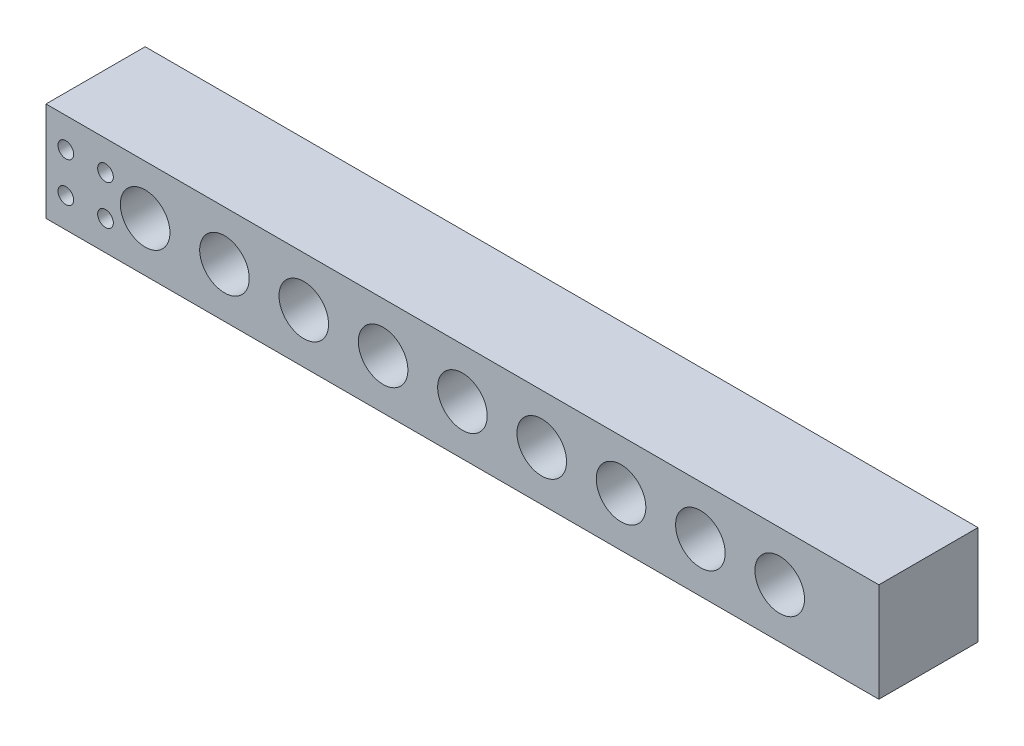
ISO-10303-21;
HEADER;
FILE_DESCRIPTION(('STEP AP214'),'2;1');
FILE_NAME('part.step','',(''),(''),'','','');
FILE_SCHEMA(('AUTOMOTIVE_DESIGN { 1 0 10303 214 1 1 1 1 }'));
ENDSEC;
DATA;
#1=APPLICATION_CONTEXT('core data for automotive mechanical design processes');
#2=APPLICATION_PROTOCOL_DEFINITION('international standard','automotive_design',2000,#1);
#3=PRODUCT_CONTEXT('',#1,'mechanical');
#4=PRODUCT('Part','Part','',(#3));
#5=PRODUCT_RELATED_PRODUCT_CATEGORY('part','',(#4));
#6=PRODUCT_DEFINITION_FORMATION('','',#4);
#7=PRODUCT_DEFINITION_CONTEXT('part definition',#1,'design');
#8=PRODUCT_DEFINITION('design','',#6,#7);
#9=PRODUCT_DEFINITION_SHAPE('','',#8);
#10=(LENGTH_UNIT() NAMED_UNIT(*) SI_UNIT(.MILLI.,.METRE.));
#11=(NAMED_UNIT(*) PLANE_ANGLE_UNIT() SI_UNIT($,.RADIAN.));
#12=(NAMED_UNIT(*) SI_UNIT($,.STERADIAN.) SOLID_ANGLE_UNIT());
#13=UNCERTAINTY_MEASURE_WITH_UNIT(LENGTH_MEASURE(1.E-05),#10,'distance_accuracy_value','');
#14=(GEOMETRIC_REPRESENTATION_CONTEXT(3) GLOBAL_UNCERTAINTY_ASSIGNED_CONTEXT((#13)) GLOBAL_UNIT_ASSIGNED_CONTEXT((#10,
#11,#12)) REPRESENTATION_CONTEXT('',''));
#15=CARTESIAN_POINT('',(0.,0.,0.));
#16=DIRECTION('',(0.,0.,1.));
#17=DIRECTION('',(1.,0.,0.));
#18=AXIS2_PLACEMENT_3D('',#15,#16,#17);
#19=CARTESIAN_POINT('',(-31.75,-15.875,0.));
#20=DIRECTION('',(0.,0.,1.));
#21=DIRECTION('',(1.,0.,0.));
#22=AXIS2_PLACEMENT_3D('',#19,#20,#21);
#23=CYLINDRICAL_SURFACE('',#22,7.93749999999998);
#24=CARTESIAN_POINT('',(-31.75,-15.875,0.));
#25=DIRECTION('',(0.,0.,1.));
#26=DIRECTION('',(1.,0.,0.));
#27=AXIS2_PLACEMENT_3D('',#24,#25,#26);
#28=CIRCLE('',#27,7.93749999999998);
#29=CARTESIAN_POINT('',(-23.8125,-15.875,0.));
#30=VERTEX_POINT('',#29);
#31=EDGE_CURVE('E41',#30,#30,#28,.T.);
#32=ORIENTED_EDGE('',*,*,#31,.F.);
#33=EDGE_LOOP('',(#32));
#34=FACE_BOUND('',#33,.T.);
#35=CARTESIAN_POINT('',(-31.75,-15.875,31.75));
#36=DIRECTION('',(0.,0.,1.));
#37=DIRECTION('',(1.,0.,0.));
#38=AXIS2_PLACEMENT_3D('',#35,#36,#37);
#39=CIRCLE('',#38,7.93749999999998);
#40=CARTESIAN_POINT('',(-23.8125,-15.875,31.75));
#41=VERTEX_POINT('',#40);
#42=EDGE_CURVE('E11',#41,#41,#39,.T.);
#43=ORIENTED_EDGE('',*,*,#42,.T.);
#44=EDGE_LOOP('',(#43));
#45=FACE_BOUND('',#44,.T.);
#46=ADVANCED_FACE('F33',(#34,#45),#23,.F.);
#47=CARTESIAN_POINT('',(-57.15,-15.875,0.));
#48=DIRECTION('',(0.,0.,1.));
#49=DIRECTION('',(1.,0.,0.));
#50=AXIS2_PLACEMENT_3D('',#47,#48,#49);
#51=CYLINDRICAL_SURFACE('',#50,7.93749999999998);
#52=CARTESIAN_POINT('',(-57.15,-15.875,0.));
#53=DIRECTION('',(0.,0.,1.));
#54=DIRECTION('',(1.,0.,0.));
#55=AXIS2_PLACEMENT_3D('',#52,#53,#54);
#56=CIRCLE('',#55,7.93749999999998);
#57=CARTESIAN_POINT('',(-49.2125,-15.875,0.));
#58=VERTEX_POINT('',#57);
#59=EDGE_CURVE('E141',#58,#58,#56,.T.);
#60=ORIENTED_EDGE('',*,*,#59,.F.);
#61=EDGE_LOOP('',(#60));
#62=FACE_BOUND('',#61,.T.);
#63=CARTESIAN_POINT('',(-57.15,-15.875,31.75));
#64=DIRECTION('',(0.,0.,1.));
#65=DIRECTION('',(1.,0.,0.));
#66=AXIS2_PLACEMENT_3D('',#63,#64,#65);
#67=CIRCLE('',#66,7.93749999999998);
#68=CARTESIAN_POINT('',(-49.2125,-15.875,31.75));
#69=VERTEX_POINT('',#68);
#70=EDGE_CURVE('E144',#69,#69,#67,.T.);
#71=ORIENTED_EDGE('',*,*,#70,.T.);
#72=EDGE_LOOP('',(#71));
#73=FACE_BOUND('',#72,.T.);
#74=ADVANCED_FACE('F153',(#62,#73),#51,.F.);
#75=CARTESIAN_POINT('',(-82.55,-15.875,0.));
#76=DIRECTION('',(0.,0.,1.));
#77=DIRECTION('',(1.,0.,0.));
#78=AXIS2_PLACEMENT_3D('',#75,#76,#77);
#79=CYLINDRICAL_SURFACE('',#78,7.93749999999998);
#80=CARTESIAN_POINT('',(-82.55,-15.875,0.));
#81=DIRECTION('',(0.,0.,1.));
#82=DIRECTION('',(1.,0.,0.));
#83=AXIS2_PLACEMENT_3D('',#80,#81,#82);
#84=CIRCLE('',#83,7.93749999999998);
#85=CARTESIAN_POINT('',(-74.6125,-15.875,0.));
#86=VERTEX_POINT('',#85);
#87=EDGE_CURVE('E135',#86,#86,#84,.T.);
#88=ORIENTED_EDGE('',*,*,#87,.F.);
#89=EDGE_LOOP('',(#88));
#90=FACE_BOUND('',#89,.T.);
#91=CARTESIAN_POINT('',(-82.55,-15.875,31.75));
#92=DIRECTION('',(0.,0.,1.));
#93=DIRECTION('',(1.,0.,0.));
#94=AXIS2_PLACEMENT_3D('',#91,#92,#93);
#95=CIRCLE('',#94,7.93749999999998);
#96=CARTESIAN_POINT('',(-74.6125,-15.875,31.75));
#97=VERTEX_POINT('',#96);
#98=EDGE_CURVE('E138',#97,#97,#95,.T.);
#99=ORIENTED_EDGE('',*,*,#98,.T.);
#100=EDGE_LOOP('',(#99));
#101=FACE_BOUND('',#100,.T.);
#102=ADVANCED_FACE('F196',(#90,#101),#79,.F.);
#103=CARTESIAN_POINT('',(-107.95,-15.875,0.));
#104=DIRECTION('',(0.,0.,1.));
#105=DIRECTION('',(1.,0.,0.));
#106=AXIS2_PLACEMENT_3D('',#103,#104,#105);
#107=CYLINDRICAL_SURFACE('',#106,7.93749999999998);
#108=CARTESIAN_POINT('',(-107.95,-15.875,0.));
#109=DIRECTION('',(0.,0.,1.));
#110=DIRECTION('',(1.,0.,0.));
#111=AXIS2_PLACEMENT_3D('',#108,#109,#110);
#112=CIRCLE('',#111,7.93749999999998);
#113=CARTESIAN_POINT('',(-100.0125,-15.875,0.));
#114=VERTEX_POINT('',#113);
#115=EDGE_CURVE('E129',#114,#114,#112,.T.);
#116=ORIENTED_EDGE('',*,*,#115,.F.);
#117=EDGE_LOOP('',(#116));
#118=FACE_BOUND('',#117,.T.);
#119=CARTESIAN_POINT('',(-107.95,-15.875,31.75));
#120=DIRECTION('',(0.,0.,1.));
#121=DIRECTION('',(1.,0.,0.));
#122=AXIS2_PLACEMENT_3D('',#119,#120,#121);
#123=CIRCLE('',#122,7.93749999999998);
#124=CARTESIAN_POINT('',(-100.0125,-15.875,31.75));
#125=VERTEX_POINT('',#124);
#126=EDGE_CURVE('E132',#125,#125,#123,.T.);
#127=ORIENTED_EDGE('',*,*,#126,.T.);
#128=EDGE_LOOP('',(#127));
#129=FACE_BOUND('',#128,.T.);
#130=ADVANCED_FACE('F192',(#118,#129),#107,.F.);
#131=CARTESIAN_POINT('',(-133.35,-15.875,0.));
#132=DIRECTION('',(0.,0.,1.));
#133=DIRECTION('',(1.,0.,0.));
#134=AXIS2_PLACEMENT_3D('',#131,#132,#133);
#135=CYLINDRICAL_SURFACE('',#134,7.93749999999998);
#136=CARTESIAN_POINT('',(-133.35,-15.875,0.));
#137=DIRECTION('',(0.,0.,1.));
#138=DIRECTION('',(1.,0.,0.));
#139=AXIS2_PLACEMENT_3D('',#136,#137,#138);
#140=CIRCLE('',#139,7.93749999999998);
#141=CARTESIAN_POINT('',(-125.4125,-15.875,0.));
#142=VERTEX_POINT('',#141);
#143=EDGE_CURVE('E123',#142,#142,#140,.T.);
#144=ORIENTED_EDGE('',*,*,#143,.F.);
#145=EDGE_LOOP('',(#144));
#146=FACE_BOUND('',#145,.T.);
#147=CARTESIAN_POINT('',(-133.35,-15.875,31.75));
#148=DIRECTION('',(0.,0.,1.));
#149=DIRECTION('',(1.,0.,0.));
#150=AXIS2_PLACEMENT_3D('',#147,#148,#149);
#151=CIRCLE('',#150,7.93749999999998);
#152=CARTESIAN_POINT('',(-125.4125,-15.875,31.75));
#153=VERTEX_POINT('',#152);
#154=EDGE_CURVE('E126',#153,#153,#151,.T.);
#155=ORIENTED_EDGE('',*,*,#154,.T.);
#156=EDGE_LOOP('',(#155));
#157=FACE_BOUND('',#156,.T.);
#158=ADVANCED_FACE('F188',(#146,#157),#135,.F.);
#159=CARTESIAN_POINT('',(-158.75,-15.875,0.));
#160=DIRECTION('',(0.,0.,1.));
#161=DIRECTION('',(1.,0.,0.));
#162=AXIS2_PLACEMENT_3D('',#159,#160,#161);
#163=CYLINDRICAL_SURFACE('',#162,7.93749999999998);
#164=CARTESIAN_POINT('',(-158.75,-15.875,0.));
#165=DIRECTION('',(0.,0.,1.));
#166=DIRECTION('',(1.,0.,0.));
#167=AXIS2_PLACEMENT_3D('',#164,#165,#166);
#168=CIRCLE('',#167,7.93749999999998);
#169=CARTESIAN_POINT('',(-150.8125,-15.875,0.));
#170=VERTEX_POINT('',#169);
#171=EDGE_CURVE('E117',#170,#170,#168,.T.);
#172=ORIENTED_EDGE('',*,*,#171,.F.);
#173=EDGE_LOOP('',(#172));
#174=FACE_BOUND('',#173,.T.);
#175=CARTESIAN_POINT('',(-158.75,-15.875,31.75));
#176=DIRECTION('',(0.,0.,1.));
#177=DIRECTION('',(1.,0.,0.));
#178=AXIS2_PLACEMENT_3D('',#175,#176,#177);
#179=CIRCLE('',#178,7.93749999999998);
#180=CARTESIAN_POINT('',(-150.8125,-15.875,31.75));
#181=VERTEX_POINT('',#180);
#182=EDGE_CURVE('E120',#181,#181,#179,.T.);
#183=ORIENTED_EDGE('',*,*,#182,.T.);
#184=EDGE_LOOP('',(#183));
#185=FACE_BOUND('',#184,.T.);
#186=ADVANCED_FACE('F184',(#174,#185),#163,.F.);
#187=CARTESIAN_POINT('',(-184.15,-15.875,0.));
#188=DIRECTION('',(0.,0.,1.));
#189=DIRECTION('',(1.,0.,0.));
#190=AXIS2_PLACEMENT_3D('',#187,#188,#189);
#191=CYLINDRICAL_SURFACE('',#190,7.93749999999998);
#192=CARTESIAN_POINT('',(-184.15,-15.875,0.));
#193=DIRECTION('',(0.,0.,1.));
#194=DIRECTION('',(1.,0.,0.));
#195=AXIS2_PLACEMENT_3D('',#192,#193,#194);
#196=CIRCLE('',#195,7.93749999999998);
#197=CARTESIAN_POINT('',(-176.2125,-15.875,0.));
#198=VERTEX_POINT('',#197);
#199=EDGE_CURVE('E111',#198,#198,#196,.T.);
#200=ORIENTED_EDGE('',*,*,#199,.F.);
#201=EDGE_LOOP('',(#200));
#202=FACE_BOUND('',#201,.T.);
#203=CARTESIAN_POINT('',(-184.15,-15.875,31.75));
#204=DIRECTION('',(0.,0.,1.));
#205=DIRECTION('',(1.,0.,0.));
#206=AXIS2_PLACEMENT_3D('',#203,#204,#205);
#207=CIRCLE('',#206,7.93749999999998);
#208=CARTESIAN_POINT('',(-176.2125,-15.875,31.75));
#209=VERTEX_POINT('',#208);
#210=EDGE_CURVE('E114',#209,#209,#207,.T.);
#211=ORIENTED_EDGE('',*,*,#210,.T.);
#212=EDGE_LOOP('',(#211));
#213=FACE_BOUND('',#212,.T.);
#214=ADVANCED_FACE('F180',(#202,#213),#191,.F.);
#215=CARTESIAN_POINT('',(0.,0.,31.75));
#216=DIRECTION('',(-1.,0.,0.));
#217=DIRECTION('',(0.,-1.,0.));
#218=AXIS2_PLACEMENT_3D('',#215,#216,#217);
#219=PLANE('',#218);
#220=DIRECTION('',(0.,1.,0.));
#221=VECTOR('',#220,1.);
#222=CARTESIAN_POINT('',(0.,0.,0.));
#223=LINE('',#222,#221);
#224=CARTESIAN_POINT('',(0.,-31.75,0.));
#225=VERTEX_POINT('',#224);
#226=CARTESIAN_POINT('',(0.,0.,0.));
#227=VERTEX_POINT('',#226);
#228=EDGE_CURVE('E101',#225,#227,#223,.T.);
#229=ORIENTED_EDGE('',*,*,#228,.T.);
#230=DIRECTION('',(0.,0.,-1.));
#231=VECTOR('',#230,1.);
#232=CARTESIAN_POINT('',(0.,0.,31.75));
#233=LINE('',#232,#231);
#234=CARTESIAN_POINT('',(0.,0.,31.75));
#235=VERTEX_POINT('',#234);
#236=EDGE_CURVE('E92',#235,#227,#233,.T.);
#237=ORIENTED_EDGE('',*,*,#236,.F.);
#238=DIRECTION('',(0.,1.,0.));
#239=VECTOR('',#238,1.);
#240=CARTESIAN_POINT('',(0.,0.,31.75));
#241=LINE('',#240,#239);
#242=CARTESIAN_POINT('',(0.,-31.75,31.75));
#243=VERTEX_POINT('',#242);
#244=EDGE_CURVE('E86',#243,#235,#241,.T.);
#245=ORIENTED_EDGE('',*,*,#244,.F.);
#246=DIRECTION('',(0.,0.,-1.));
#247=VECTOR('',#246,1.);
#248=CARTESIAN_POINT('',(0.,-31.75,31.75));
#249=LINE('',#248,#247);
#250=EDGE_CURVE('E97',#243,#225,#249,.T.);
#251=ORIENTED_EDGE('',*,*,#250,.T.);
#252=EDGE_LOOP('',(#229,#237,#245,#251));
#253=FACE_BOUND('',#252,.T.);
#254=ADVANCED_FACE('F177',(#253),#219,.F.);
#255=CARTESIAN_POINT('',(0.,0.,31.75));
#256=DIRECTION('',(0.,-1.,0.));
#257=DIRECTION('',(0.,0.,-1.));
#258=AXIS2_PLACEMENT_3D('',#255,#256,#257);
#259=PLANE('',#258);
#260=DIRECTION('',(-1.,0.,0.));
#261=VECTOR('',#260,1.);
#262=CARTESIAN_POINT('',(0.,0.,0.));
#263=LINE('',#262,#261);
#264=CARTESIAN_POINT('',(-266.7,0.,0.));
#265=VERTEX_POINT('',#264);
#266=EDGE_CURVE('E91',#227,#265,#263,.T.);
#267=ORIENTED_EDGE('',*,*,#266,.T.);
#268=DIRECTION('',(0.,0.,-1.));
#269=VECTOR('',#268,1.);
#270=CARTESIAN_POINT('',(-266.7,0.,31.75));
#271=LINE('',#270,#269);
#272=CARTESIAN_POINT('',(-266.7,0.,31.75));
#273=VERTEX_POINT('',#272);
#274=EDGE_CURVE('E89',#273,#265,#271,.T.);
#275=ORIENTED_EDGE('',*,*,#274,.F.);
#276=DIRECTION('',(-1.,0.,0.));
#277=VECTOR('',#276,1.);
#278=CARTESIAN_POINT('',(0.,0.,31.75));
#279=LINE('',#278,#277);
#280=EDGE_CURVE('E80',#235,#273,#279,.T.);
#281=ORIENTED_EDGE('',*,*,#280,.F.);
#282=ORIENTED_EDGE('',*,*,#236,.T.);
#283=EDGE_LOOP('',(#267,#275,#281,#282));
#284=FACE_BOUND('',#283,.T.);
#285=ADVANCED_FACE('F90',(#284),#259,.F.);
#286=CARTESIAN_POINT('',(-266.7,0.,31.75));
#287=DIRECTION('',(1.,0.,0.));
#288=DIRECTION('',(0.,0.,-1.));
#289=AXIS2_PLACEMENT_3D('',#286,#287,#288);
#290=PLANE('',#289);
#291=DIRECTION('',(0.,-1.,0.));
#292=VECTOR('',#291,1.);
#293=CARTESIAN_POINT('',(-266.7,0.,0.));
#294=LINE('',#293,#292);
#295=CARTESIAN_POINT('',(-266.7,-31.75,0.));
#296=VERTEX_POINT('',#295);
#297=EDGE_CURVE('E66',#265,#296,#294,.T.);
#298=ORIENTED_EDGE('',*,*,#297,.T.);
#299=DIRECTION('',(0.,0.,-1.));
#300=VECTOR('',#299,1.);
#301=CARTESIAN_POINT('',(-266.7,-31.75,31.75));
#302=LINE('',#301,#300);
#303=CARTESIAN_POINT('',(-266.7,-31.75,31.75));
#304=VERTEX_POINT('',#303);
#305=EDGE_CURVE('E93',#304,#296,#302,.T.);
#306=ORIENTED_EDGE('',*,*,#305,.F.);
#307=DIRECTION('',(0.,-1.,0.));
#308=VECTOR('',#307,1.);
#309=CARTESIAN_POINT('',(-266.7,0.,31.75));
#310=LINE('',#309,#308);
#311=EDGE_CURVE('E84',#273,#304,#310,.T.);
#312=ORIENTED_EDGE('',*,*,#311,.F.);
#313=ORIENTED_EDGE('',*,*,#274,.T.);
#314=EDGE_LOOP('',(#298,#306,#312,#313));
#315=FACE_BOUND('',#314,.T.);
#316=ADVANCED_FACE('F95',(#315),#290,.F.);
#317=CARTESIAN_POINT('',(0.,-31.75,31.75));
#318=DIRECTION('',(0.,1.,0.));
#319=DIRECTION('',(-1.,0.,0.));
#320=AXIS2_PLACEMENT_3D('',#317,#318,#319);
#321=PLANE('',#320);
#322=DIRECTION('',(1.,0.,0.));
#323=VECTOR('',#322,1.);
#324=CARTESIAN_POINT('',(0.,-31.75,0.));
#325=LINE('',#324,#323);
#326=EDGE_CURVE('E72',#296,#225,#325,.T.);
#327=ORIENTED_EDGE('',*,*,#326,.T.);
#328=ORIENTED_EDGE('',*,*,#250,.F.);
#329=DIRECTION('',(1.,0.,0.));
#330=VECTOR('',#329,1.);
#331=CARTESIAN_POINT('',(0.,-31.75,31.75));
#332=LINE('',#331,#330);
#333=EDGE_CURVE('E49',#304,#243,#332,.T.);
#334=ORIENTED_EDGE('',*,*,#333,.F.);
#335=ORIENTED_EDGE('',*,*,#305,.T.);
#336=EDGE_LOOP('',(#327,#328,#334,#335));
#337=FACE_BOUND('',#336,.T.);
#338=ADVANCED_FACE('F157',(#337),#321,.F.);
#339=CARTESIAN_POINT('',(0.,0.,31.75));
#340=DIRECTION('',(0.,0.,-1.));
#341=DIRECTION('',(-1.,0.,0.));
#342=AXIS2_PLACEMENT_3D('',#339,#340,#341);
#343=PLANE('',#342);
#344=CARTESIAN_POINT('',(-247.65,-9.52500000000004,31.75));
#345=DIRECTION('',(0.,0.,1.));
#346=DIRECTION('',(1.,0.,0.));
#347=AXIS2_PLACEMENT_3D('',#344,#345,#346);
#348=CIRCLE('',#347,2.50824999999999);
#349=CARTESIAN_POINT('',(-245.14175,-9.52500000000004,31.75));
#350=VERTEX_POINT('',#349);
#351=EDGE_CURVE('E332',#350,#350,#348,.T.);
#352=ORIENTED_EDGE('',*,*,#351,.F.);
#353=EDGE_LOOP('',(#352));
#354=FACE_BOUND('',#353,.T.);
#355=CARTESIAN_POINT('',(-260.35,-22.225,31.75));
#356=DIRECTION('',(0.,0.,1.));
#357=DIRECTION('',(1.,0.,0.));
#358=AXIS2_PLACEMENT_3D('',#355,#356,#357);
#359=CIRCLE('',#358,2.50824999999996);
#360=CARTESIAN_POINT('',(-257.84175,-22.225,31.75));
#361=VERTEX_POINT('',#360);
#362=EDGE_CURVE('E338',#361,#361,#359,.T.);
#363=ORIENTED_EDGE('',*,*,#362,.F.);
#364=EDGE_LOOP('',(#363));
#365=FACE_BOUND('',#364,.T.);
#366=CARTESIAN_POINT('',(-247.65,-22.225,31.75));
#367=DIRECTION('',(0.,0.,1.));
#368=DIRECTION('',(1.,0.,0.));
#369=AXIS2_PLACEMENT_3D('',#366,#367,#368);
#370=CIRCLE('',#369,2.50824999999999);
#371=CARTESIAN_POINT('',(-245.14175,-22.225,31.75));
#372=VERTEX_POINT('',#371);
#373=EDGE_CURVE('E404',#372,#372,#370,.T.);
#374=ORIENTED_EDGE('',*,*,#373,.F.);
#375=EDGE_LOOP('',(#374));
#376=FACE_BOUND('',#375,.T.);
#377=CARTESIAN_POINT('',(-260.35,-9.52500000000004,31.75));
#378=DIRECTION('',(0.,0.,1.));
#379=DIRECTION('',(1.,0.,0.));
#380=AXIS2_PLACEMENT_3D('',#377,#378,#379);
#381=CIRCLE('',#380,2.50824999999996);
#382=CARTESIAN_POINT('',(-257.84175,-9.52500000000004,31.75));
#383=VERTEX_POINT('',#382);
#384=EDGE_CURVE('E335',#383,#383,#381,.T.);
#385=ORIENTED_EDGE('',*,*,#384,.F.);
#386=EDGE_LOOP('',(#385));
#387=FACE_BOUND('',#386,.T.);
#388=CARTESIAN_POINT('',(-209.55,-15.875,31.75));
#389=DIRECTION('',(0.,0.,1.));
#390=DIRECTION('',(1.,0.,0.));
#391=AXIS2_PLACEMENT_3D('',#388,#389,#390);
#392=CIRCLE('',#391,7.93749999999998);
#393=CARTESIAN_POINT('',(-201.6125,-15.875,31.75));
#394=VERTEX_POINT('',#393);
#395=EDGE_CURVE('E353',#394,#394,#392,.T.);
#396=ORIENTED_EDGE('',*,*,#395,.F.);
#397=EDGE_LOOP('',(#396));
#398=FACE_BOUND('',#397,.T.);
#399=CARTESIAN_POINT('',(-234.95,-15.875,31.75));
#400=DIRECTION('',(0.,0.,1.));
#401=DIRECTION('',(1.,0.,0.));
#402=AXIS2_PLACEMENT_3D('',#399,#400,#401);
#403=CIRCLE('',#402,7.93749999999998);
#404=CARTESIAN_POINT('',(-227.0125,-15.875,31.75));
#405=VERTEX_POINT('',#404);
#406=EDGE_CURVE('E356',#405,#405,#403,.T.);
#407=ORIENTED_EDGE('',*,*,#406,.F.);
#408=EDGE_LOOP('',(#407));
#409=FACE_BOUND('',#408,.T.);
#410=ORIENTED_EDGE('',*,*,#244,.T.);
#411=ORIENTED_EDGE('',*,*,#280,.T.);
#412=ORIENTED_EDGE('',*,*,#311,.T.);
#413=ORIENTED_EDGE('',*,*,#333,.T.);
#414=EDGE_LOOP('',(#410,#411,#412,#413));
#415=FACE_BOUND('',#414,.T.);
#416=ORIENTED_EDGE('',*,*,#210,.F.);
#417=EDGE_LOOP('',(#416));
#418=FACE_BOUND('',#417,.T.);
#419=ORIENTED_EDGE('',*,*,#182,.F.);
#420=EDGE_LOOP('',(#419));
#421=FACE_BOUND('',#420,.T.);
#422=ORIENTED_EDGE('',*,*,#154,.F.);
#423=EDGE_LOOP('',(#422));
#424=FACE_BOUND('',#423,.T.);
#425=ORIENTED_EDGE('',*,*,#126,.F.);
#426=EDGE_LOOP('',(#425));
#427=FACE_BOUND('',#426,.T.);
#428=ORIENTED_EDGE('',*,*,#98,.F.);
#429=EDGE_LOOP('',(#428));
#430=FACE_BOUND('',#429,.T.);
#431=ORIENTED_EDGE('',*,*,#70,.F.);
#432=EDGE_LOOP('',(#431));
#433=FACE_BOUND('',#432,.T.);
#434=ORIENTED_EDGE('',*,*,#42,.F.);
#435=EDGE_LOOP('',(#434));
#436=FACE_BOUND('',#435,.T.);
#437=ADVANCED_FACE('F81',(#354,#365,#376,#387,#398,#409,#415,#418,#421,#424,#427,#430,#433,
#436),#343,.F.);
#438=CARTESIAN_POINT('',(0.,0.,0.));
#439=DIRECTION('',(0.,0.,-1.));
#440=DIRECTION('',(-1.,0.,0.));
#441=AXIS2_PLACEMENT_3D('',#438,#439,#440);
#442=PLANE('',#441);
#443=CARTESIAN_POINT('',(-247.65,-9.52500000000004,0.));
#444=DIRECTION('',(0.,0.,1.));
#445=DIRECTION('',(1.,0.,0.));
#446=AXIS2_PLACEMENT_3D('',#443,#444,#445);
#447=CIRCLE('',#446,2.50824999999999);
#448=CARTESIAN_POINT('',(-245.14175,-9.52500000000004,0.));
#449=VERTEX_POINT('',#448);
#450=EDGE_CURVE('E330',#449,#449,#447,.T.);
#451=ORIENTED_EDGE('',*,*,#450,.T.);
#452=EDGE_LOOP('',(#451));
#453=FACE_BOUND('',#452,.T.);
#454=CARTESIAN_POINT('',(-260.35,-22.225,0.));
#455=DIRECTION('',(0.,0.,1.));
#456=DIRECTION('',(1.,0.,0.));
#457=AXIS2_PLACEMENT_3D('',#454,#455,#456);
#458=CIRCLE('',#457,2.50824999999996);
#459=CARTESIAN_POINT('',(-257.84175,-22.225,0.));
#460=VERTEX_POINT('',#459);
#461=EDGE_CURVE('E333',#460,#460,#458,.T.);
#462=ORIENTED_EDGE('',*,*,#461,.T.);
#463=EDGE_LOOP('',(#462));
#464=FACE_BOUND('',#463,.T.);
#465=CARTESIAN_POINT('',(-247.65,-22.225,0.));
#466=DIRECTION('',(0.,0.,1.));
#467=DIRECTION('',(1.,0.,0.));
#468=AXIS2_PLACEMENT_3D('',#465,#466,#467);
#469=CIRCLE('',#468,2.50824999999999);
#470=CARTESIAN_POINT('',(-245.14175,-22.225,0.));
#471=VERTEX_POINT('',#470);
#472=EDGE_CURVE('E344',#471,#471,#469,.T.);
#473=ORIENTED_EDGE('',*,*,#472,.T.);
#474=EDGE_LOOP('',(#473));
#475=FACE_BOUND('',#474,.T.);
#476=CARTESIAN_POINT('',(-260.35,-9.52500000000004,0.));
#477=DIRECTION('',(0.,0.,1.));
#478=DIRECTION('',(1.,0.,0.));
#479=AXIS2_PLACEMENT_3D('',#476,#477,#478);
#480=CIRCLE('',#479,2.50824999999996);
#481=CARTESIAN_POINT('',(-257.84175,-9.52500000000004,0.));
#482=VERTEX_POINT('',#481);
#483=EDGE_CURVE('E345',#482,#482,#480,.T.);
#484=ORIENTED_EDGE('',*,*,#483,.T.);
#485=EDGE_LOOP('',(#484));
#486=FACE_BOUND('',#485,.T.);
#487=CARTESIAN_POINT('',(-209.55,-15.875,0.));
#488=DIRECTION('',(0.,0.,1.));
#489=DIRECTION('',(1.,0.,0.));
#490=AXIS2_PLACEMENT_3D('',#487,#488,#489);
#491=CIRCLE('',#490,7.93749999999998);
#492=CARTESIAN_POINT('',(-201.6125,-15.875,0.));
#493=VERTEX_POINT('',#492);
#494=EDGE_CURVE('E348',#493,#493,#491,.T.);
#495=ORIENTED_EDGE('',*,*,#494,.T.);
#496=EDGE_LOOP('',(#495));
#497=FACE_BOUND('',#496,.T.);
#498=CARTESIAN_POINT('',(-234.95,-15.875,0.));
#499=DIRECTION('',(0.,0.,1.));
#500=DIRECTION('',(1.,0.,0.));
#501=AXIS2_PLACEMENT_3D('',#498,#499,#500);
#502=CIRCLE('',#501,7.93749999999998);
#503=CARTESIAN_POINT('',(-227.0125,-15.875,0.));
#504=VERTEX_POINT('',#503);
#505=EDGE_CURVE('E104',#504,#504,#502,.T.);
#506=ORIENTED_EDGE('',*,*,#505,.T.);
#507=EDGE_LOOP('',(#506));
#508=FACE_BOUND('',#507,.T.);
#509=ORIENTED_EDGE('',*,*,#228,.F.);
#510=ORIENTED_EDGE('',*,*,#326,.F.);
#511=ORIENTED_EDGE('',*,*,#297,.F.);
#512=ORIENTED_EDGE('',*,*,#266,.F.);
#513=EDGE_LOOP('',(#509,#510,#511,#512));
#514=FACE_BOUND('',#513,.T.);
#515=ORIENTED_EDGE('',*,*,#199,.T.);
#516=EDGE_LOOP('',(#515));
#517=FACE_BOUND('',#516,.T.);
#518=ORIENTED_EDGE('',*,*,#171,.T.);
#519=EDGE_LOOP('',(#518));
#520=FACE_BOUND('',#519,.T.);
#521=ORIENTED_EDGE('',*,*,#143,.T.);
#522=EDGE_LOOP('',(#521));
#523=FACE_BOUND('',#522,.T.);
#524=ORIENTED_EDGE('',*,*,#115,.T.);
#525=EDGE_LOOP('',(#524));
#526=FACE_BOUND('',#525,.T.);
#527=ORIENTED_EDGE('',*,*,#87,.T.);
#528=EDGE_LOOP('',(#527));
#529=FACE_BOUND('',#528,.T.);
#530=ORIENTED_EDGE('',*,*,#59,.T.);
#531=EDGE_LOOP('',(#530));
#532=FACE_BOUND('',#531,.T.);
#533=ORIENTED_EDGE('',*,*,#31,.T.);
#534=EDGE_LOOP('',(#533));
#535=FACE_BOUND('',#534,.T.);
#536=ADVANCED_FACE('F149',(#453,#464,#475,#486,#497,#508,#514,#517,#520,#523,#526,#529,#532,
#535),#442,.T.);
#537=CARTESIAN_POINT('',(-234.95,-15.875,0.));
#538=DIRECTION('',(0.,0.,1.));
#539=DIRECTION('',(1.,0.,0.));
#540=AXIS2_PLACEMENT_3D('',#537,#538,#539);
#541=CYLINDRICAL_SURFACE('',#540,7.93749999999998);
#542=ORIENTED_EDGE('',*,*,#505,.F.);
#543=EDGE_LOOP('',(#542));
#544=FACE_BOUND('',#543,.T.);
#545=ORIENTED_EDGE('',*,*,#406,.T.);
#546=EDGE_LOOP('',(#545));
#547=FACE_BOUND('',#546,.T.);
#548=ADVANCED_FACE('F164',(#544,#547),#541,.F.);
#549=CARTESIAN_POINT('',(-209.55,-15.875,0.));
#550=DIRECTION('',(0.,0.,1.));
#551=DIRECTION('',(1.,0.,0.));
#552=AXIS2_PLACEMENT_3D('',#549,#550,#551);
#553=CYLINDRICAL_SURFACE('',#552,7.93749999999998);
#554=ORIENTED_EDGE('',*,*,#494,.F.);
#555=EDGE_LOOP('',(#554));
#556=FACE_BOUND('',#555,.T.);
#557=ORIENTED_EDGE('',*,*,#395,.T.);
#558=EDGE_LOOP('',(#557));
#559=FACE_BOUND('',#558,.T.);
#560=ADVANCED_FACE('F257',(#556,#559),#553,.F.);
#561=CARTESIAN_POINT('',(-260.35,-9.52500000000004,0.));
#562=DIRECTION('',(0.,0.,1.));
#563=DIRECTION('',(1.,0.,0.));
#564=AXIS2_PLACEMENT_3D('',#561,#562,#563);
#565=CYLINDRICAL_SURFACE('',#564,2.50824999999996);
#566=ORIENTED_EDGE('',*,*,#483,.F.);
#567=EDGE_LOOP('',(#566));
#568=FACE_BOUND('',#567,.T.);
#569=ORIENTED_EDGE('',*,*,#384,.T.);
#570=EDGE_LOOP('',(#569));
#571=FACE_BOUND('',#570,.T.);
#572=ADVANCED_FACE('F284',(#568,#571),#565,.F.);
#573=CARTESIAN_POINT('',(-247.65,-22.225,0.));
#574=DIRECTION('',(0.,0.,1.));
#575=DIRECTION('',(1.,0.,0.));
#576=AXIS2_PLACEMENT_3D('',#573,#574,#575);
#577=CYLINDRICAL_SURFACE('',#576,2.50824999999999);
#578=ORIENTED_EDGE('',*,*,#472,.F.);
#579=EDGE_LOOP('',(#578));
#580=FACE_BOUND('',#579,.T.);
#581=ORIENTED_EDGE('',*,*,#373,.T.);
#582=EDGE_LOOP('',(#581));
#583=FACE_BOUND('',#582,.T.);
#584=ADVANCED_FACE('F292',(#580,#583),#577,.F.);
#585=CARTESIAN_POINT('',(-260.35,-22.225,0.));
#586=DIRECTION('',(0.,0.,1.));
#587=DIRECTION('',(1.,0.,0.));
#588=AXIS2_PLACEMENT_3D('',#585,#586,#587);
#589=CYLINDRICAL_SURFACE('',#588,2.50824999999996);
#590=ORIENTED_EDGE('',*,*,#461,.F.);
#591=EDGE_LOOP('',(#590));
#592=FACE_BOUND('',#591,.T.);
#593=ORIENTED_EDGE('',*,*,#362,.T.);
#594=EDGE_LOOP('',(#593));
#595=FACE_BOUND('',#594,.T.);
#596=ADVANCED_FACE('F302',(#592,#595),#589,.F.);
#597=CARTESIAN_POINT('',(-247.65,-9.52500000000004,0.));
#598=DIRECTION('',(0.,0.,1.));
#599=DIRECTION('',(1.,0.,0.));
#600=AXIS2_PLACEMENT_3D('',#597,#598,#599);
#601=CYLINDRICAL_SURFACE('',#600,2.50824999999999);
#602=ORIENTED_EDGE('',*,*,#450,.F.);
#603=EDGE_LOOP('',(#602));
#604=FACE_BOUND('',#603,.T.);
#605=ORIENTED_EDGE('',*,*,#351,.T.);
#606=EDGE_LOOP('',(#605));
#607=FACE_BOUND('',#606,.T.);
#608=ADVANCED_FACE('F311',(#604,#607),#601,.F.);
#609=CLOSED_SHELL('',(#46,#74,#102,#130,#158,#186,#214,#254,#285,#316,#338,#437,#536,#548,#560,
#572,#584,#596,#608));
#610=MANIFOLD_SOLID_BREP('B2',#609);
#611=ADVANCED_BREP_SHAPE_REPRESENTATION('',(#18,#610),#14);
#612=SHAPE_DEFINITION_REPRESENTATION(#9,#611);
ENDSEC;
END-ISO-10303-21;
